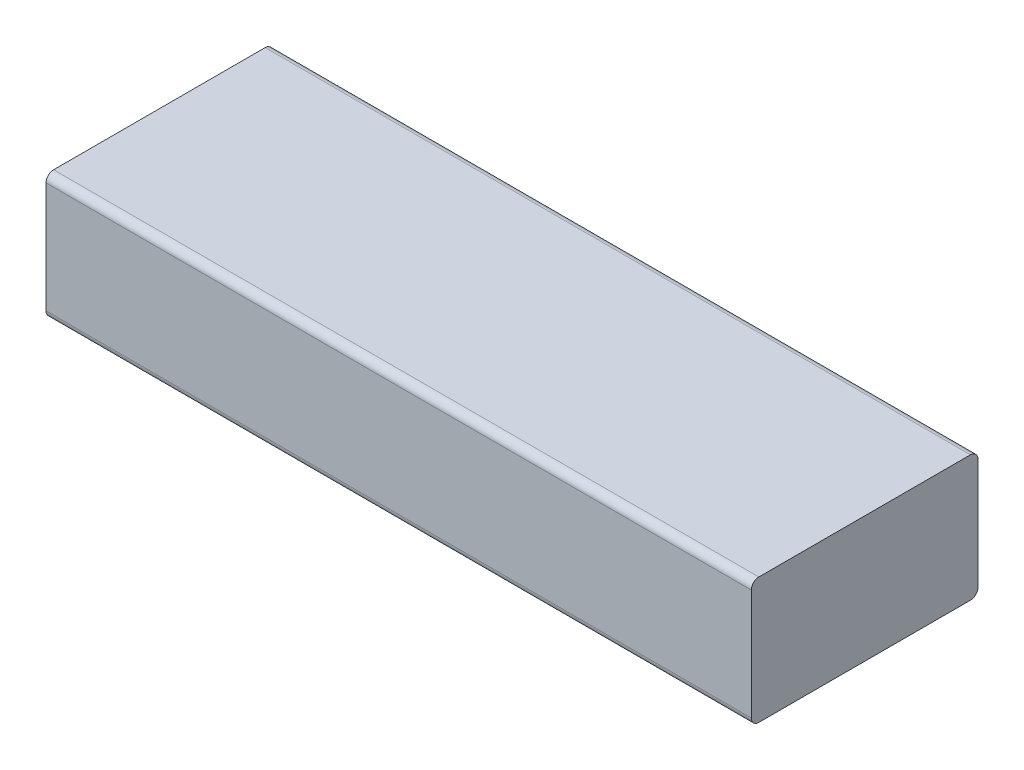
ISO-10303-21;
HEADER;
FILE_DESCRIPTION(('STEP AP214'),'2;1');
FILE_NAME('part.step','',(''),(''),'','','');
FILE_SCHEMA(('AUTOMOTIVE_DESIGN { 1 0 10303 214 1 1 1 1 }'));
ENDSEC;
DATA;
#1=APPLICATION_CONTEXT('core data for automotive mechanical design processes');
#2=APPLICATION_PROTOCOL_DEFINITION('international standard','automotive_design',2000,#1);
#3=PRODUCT_CONTEXT('',#1,'mechanical');
#4=PRODUCT('Part','Part','',(#3));
#5=PRODUCT_RELATED_PRODUCT_CATEGORY('part','',(#4));
#6=PRODUCT_DEFINITION_FORMATION('','',#4);
#7=PRODUCT_DEFINITION_CONTEXT('part definition',#1,'design');
#8=PRODUCT_DEFINITION('design','',#6,#7);
#9=PRODUCT_DEFINITION_SHAPE('','',#8);
#10=(LENGTH_UNIT() NAMED_UNIT(*) SI_UNIT(.MILLI.,.METRE.));
#11=(NAMED_UNIT(*) PLANE_ANGLE_UNIT() SI_UNIT($,.RADIAN.));
#12=(NAMED_UNIT(*) SI_UNIT($,.STERADIAN.) SOLID_ANGLE_UNIT());
#13=UNCERTAINTY_MEASURE_WITH_UNIT(LENGTH_MEASURE(1.E-05),#10,'distance_accuracy_value','');
#14=(GEOMETRIC_REPRESENTATION_CONTEXT(3) GLOBAL_UNCERTAINTY_ASSIGNED_CONTEXT((#13)) GLOBAL_UNIT_ASSIGNED_CONTEXT((#10,
#11,#12)) REPRESENTATION_CONTEXT('',''));
#15=CARTESIAN_POINT('',(0.,0.,0.));
#16=DIRECTION('',(0.,0.,1.));
#17=DIRECTION('',(1.,0.,0.));
#18=AXIS2_PLACEMENT_3D('',#15,#16,#17);
#19=CARTESIAN_POINT('',(0.,25.,0.));
#20=DIRECTION('',(0.,0.,-1.));
#21=DIRECTION('',(-1.,0.,0.));
#22=AXIS2_PLACEMENT_3D('',#19,#20,#21);
#23=PLANE('',#22);
#24=DIRECTION('',(0.,-1.,0.));
#25=VECTOR('',#24,1.);
#26=CARTESIAN_POINT('',(-70.,25.,0.));
#27=LINE('',#26,#25);
#28=CARTESIAN_POINT('',(-70.,23.5,0.));
#29=VERTEX_POINT('',#28);
#30=CARTESIAN_POINT('',(-70.,1.5,0.));
#31=VERTEX_POINT('',#30);
#32=EDGE_CURVE('E126',#29,#31,#27,.T.);
#33=ORIENTED_EDGE('',*,*,#32,.T.);
#34=DIRECTION('',(1.,0.,0.));
#35=VECTOR('',#34,1.);
#36=CARTESIAN_POINT('',(0.,1.5,0.));
#37=LINE('',#36,#35);
#38=CARTESIAN_POINT('',(70.,1.5,0.));
#39=VERTEX_POINT('',#38);
#40=EDGE_CURVE('E11',#31,#39,#37,.T.);
#41=ORIENTED_EDGE('',*,*,#40,.T.);
#42=DIRECTION('',(0.,-1.,0.));
#43=VECTOR('',#42,1.);
#44=CARTESIAN_POINT('',(70.,25.,0.));
#45=LINE('',#44,#43);
#46=CARTESIAN_POINT('',(70.,23.5,0.));
#47=VERTEX_POINT('',#46);
#48=EDGE_CURVE('E131',#47,#39,#45,.T.);
#49=ORIENTED_EDGE('',*,*,#48,.F.);
#50=DIRECTION('',(1.,0.,0.));
#51=VECTOR('',#50,1.);
#52=CARTESIAN_POINT('',(-70.,23.5,0.));
#53=LINE('',#52,#51);
#54=EDGE_CURVE('E46',#47,#29,#53,.F.);
#55=ORIENTED_EDGE('',*,*,#54,.T.);
#56=EDGE_LOOP('',(#33,#41,#49,#55));
#57=FACE_BOUND('',#56,.T.);
#58=ADVANCED_FACE('F38',(#57),#23,.F.);
#59=CARTESIAN_POINT('',(70.,25.,0.));
#60=DIRECTION('',(-1.,0.,0.));
#61=DIRECTION('',(0.,0.,1.));
#62=AXIS2_PLACEMENT_3D('',#59,#60,#61);
#63=PLANE('',#62);
#64=DIRECTION('',(0.,0.,-1.));
#65=VECTOR('',#64,1.);
#66=CARTESIAN_POINT('',(70.,0.,0.));
#67=LINE('',#66,#65);
#68=CARTESIAN_POINT('',(70.,0.,-1.5));
#69=VERTEX_POINT('',#68);
#70=CARTESIAN_POINT('',(70.,0.,-43.5));
#71=VERTEX_POINT('',#70);
#72=EDGE_CURVE('E173',#69,#71,#67,.T.);
#73=ORIENTED_EDGE('',*,*,#72,.T.);
#74=CARTESIAN_POINT('',(70.,1.5,-43.5));
#75=DIRECTION('',(-1.,0.,0.));
#76=DIRECTION('',(0.,0.,1.));
#77=AXIS2_PLACEMENT_3D('',#74,#75,#76);
#78=CIRCLE('',#77,1.5);
#79=CARTESIAN_POINT('',(70.,1.5,-45.));
#80=VERTEX_POINT('',#79);
#81=EDGE_CURVE('E148',#71,#80,#78,.F.);
#82=ORIENTED_EDGE('',*,*,#81,.T.);
#83=DIRECTION('',(0.,-1.,0.));
#84=VECTOR('',#83,1.);
#85=CARTESIAN_POINT('',(70.,25.,-45.));
#86=LINE('',#85,#84);
#87=CARTESIAN_POINT('',(70.,23.5,-45.));
#88=VERTEX_POINT('',#87);
#89=EDGE_CURVE('E125',#88,#80,#86,.T.);
#90=ORIENTED_EDGE('',*,*,#89,.F.);
#91=CARTESIAN_POINT('',(70.,23.5,-43.5));
#92=DIRECTION('',(-1.,0.,0.));
#93=DIRECTION('',(0.,0.,1.));
#94=AXIS2_PLACEMENT_3D('',#91,#92,#93);
#95=CIRCLE('',#94,1.5);
#96=CARTESIAN_POINT('',(70.,25.,-43.5));
#97=VERTEX_POINT('',#96);
#98=EDGE_CURVE('E130',#88,#97,#95,.F.);
#99=ORIENTED_EDGE('',*,*,#98,.T.);
#100=DIRECTION('',(0.,0.,-1.));
#101=VECTOR('',#100,1.);
#102=CARTESIAN_POINT('',(70.,25.,0.));
#103=LINE('',#102,#101);
#104=CARTESIAN_POINT('',(70.,25.,-1.5));
#105=VERTEX_POINT('',#104);
#106=EDGE_CURVE('E167',#105,#97,#103,.T.);
#107=ORIENTED_EDGE('',*,*,#106,.F.);
#108=CARTESIAN_POINT('',(70.,23.5,-1.5));
#109=DIRECTION('',(-1.,0.,0.));
#110=DIRECTION('',(0.,0.,1.));
#111=AXIS2_PLACEMENT_3D('',#108,#109,#110);
#112=CIRCLE('',#111,1.5);
#113=EDGE_CURVE('E60',#105,#47,#112,.F.);
#114=ORIENTED_EDGE('',*,*,#113,.T.);
#115=ORIENTED_EDGE('',*,*,#48,.T.);
#116=CARTESIAN_POINT('',(70.,1.5,-1.5));
#117=DIRECTION('',(-1.,0.,0.));
#118=DIRECTION('',(0.,0.,1.));
#119=AXIS2_PLACEMENT_3D('',#116,#117,#118);
#120=CIRCLE('',#119,1.5);
#121=EDGE_CURVE('E53',#39,#69,#120,.F.);
#122=ORIENTED_EDGE('',*,*,#121,.T.);
#123=EDGE_LOOP('',(#73,#82,#90,#99,#107,#114,#115,#122));
#124=FACE_BOUND('',#123,.T.);
#125=ADVANCED_FACE('F169',(#124),#63,.F.);
#126=CARTESIAN_POINT('',(70.,25.,-45.));
#127=DIRECTION('',(0.,0.,1.));
#128=DIRECTION('',(1.,0.,0.));
#129=AXIS2_PLACEMENT_3D('',#126,#127,#128);
#130=PLANE('',#129);
#131=ORIENTED_EDGE('',*,*,#89,.T.);
#132=DIRECTION('',(-1.,0.,0.));
#133=VECTOR('',#132,1.);
#134=CARTESIAN_POINT('',(70.,1.5,-45.));
#135=LINE('',#134,#133);
#136=CARTESIAN_POINT('',(-70.,1.5,-45.));
#137=VERTEX_POINT('',#136);
#138=EDGE_CURVE('E124',#80,#137,#135,.T.);
#139=ORIENTED_EDGE('',*,*,#138,.T.);
#140=DIRECTION('',(0.,-1.,0.));
#141=VECTOR('',#140,1.);
#142=CARTESIAN_POINT('',(-70.,25.,-45.));
#143=LINE('',#142,#141);
#144=CARTESIAN_POINT('',(-70.,23.5,-45.));
#145=VERTEX_POINT('',#144);
#146=EDGE_CURVE('E107',#145,#137,#143,.T.);
#147=ORIENTED_EDGE('',*,*,#146,.F.);
#148=DIRECTION('',(-1.,0.,0.));
#149=VECTOR('',#148,1.);
#150=CARTESIAN_POINT('',(70.,23.5,-45.));
#151=LINE('',#150,#149);
#152=EDGE_CURVE('E121',#145,#88,#151,.F.);
#153=ORIENTED_EDGE('',*,*,#152,.T.);
#154=EDGE_LOOP('',(#131,#139,#147,#153));
#155=FACE_BOUND('',#154,.T.);
#156=ADVANCED_FACE('F120',(#155),#130,.F.);
#157=CARTESIAN_POINT('',(-70.,25.,-45.));
#158=DIRECTION('',(1.,0.,0.));
#159=DIRECTION('',(0.,0.,-1.));
#160=AXIS2_PLACEMENT_3D('',#157,#158,#159);
#161=PLANE('',#160);
#162=ORIENTED_EDGE('',*,*,#146,.T.);
#163=CARTESIAN_POINT('',(-70.,1.5,-43.5));
#164=DIRECTION('',(1.,0.,0.));
#165=DIRECTION('',(0.,0.,-1.));
#166=AXIS2_PLACEMENT_3D('',#163,#164,#165);
#167=CIRCLE('',#166,1.5);
#168=CARTESIAN_POINT('',(-70.,0.,-43.5));
#169=VERTEX_POINT('',#168);
#170=EDGE_CURVE('E114',#137,#169,#167,.F.);
#171=ORIENTED_EDGE('',*,*,#170,.T.);
#172=DIRECTION('',(0.,0.,1.));
#173=VECTOR('',#172,1.);
#174=CARTESIAN_POINT('',(-70.,0.,-45.));
#175=LINE('',#174,#173);
#176=CARTESIAN_POINT('',(-70.,0.,-1.50000000000002));
#177=VERTEX_POINT('',#176);
#178=EDGE_CURVE('E170',#169,#177,#175,.T.);
#179=ORIENTED_EDGE('',*,*,#178,.T.);
#180=CARTESIAN_POINT('',(-70.,1.5,-1.5));
#181=DIRECTION('',(1.,0.,0.));
#182=DIRECTION('',(0.,0.,-1.));
#183=AXIS2_PLACEMENT_3D('',#180,#181,#182);
#184=CIRCLE('',#183,1.5);
#185=EDGE_CURVE('E115',#177,#31,#184,.F.);
#186=ORIENTED_EDGE('',*,*,#185,.T.);
#187=ORIENTED_EDGE('',*,*,#32,.F.);
#188=CARTESIAN_POINT('',(-70.,23.5,-1.5));
#189=DIRECTION('',(1.,0.,0.));
#190=DIRECTION('',(0.,0.,-1.));
#191=AXIS2_PLACEMENT_3D('',#188,#189,#190);
#192=CIRCLE('',#191,1.5);
#193=CARTESIAN_POINT('',(-70.,25.,-1.50000000000002));
#194=VERTEX_POINT('',#193);
#195=EDGE_CURVE('E133',#29,#194,#192,.F.);
#196=ORIENTED_EDGE('',*,*,#195,.T.);
#197=DIRECTION('',(0.,0.,1.));
#198=VECTOR('',#197,1.);
#199=CARTESIAN_POINT('',(-70.,25.,-45.));
#200=LINE('',#199,#198);
#201=CARTESIAN_POINT('',(-70.,25.,-43.5));
#202=VERTEX_POINT('',#201);
#203=EDGE_CURVE('E109',#202,#194,#200,.T.);
#204=ORIENTED_EDGE('',*,*,#203,.F.);
#205=CARTESIAN_POINT('',(-70.,23.5,-43.5));
#206=DIRECTION('',(1.,0.,0.));
#207=DIRECTION('',(0.,0.,-1.));
#208=AXIS2_PLACEMENT_3D('',#205,#206,#207);
#209=CIRCLE('',#208,1.5);
#210=EDGE_CURVE('E104',#202,#145,#209,.F.);
#211=ORIENTED_EDGE('',*,*,#210,.T.);
#212=EDGE_LOOP('',(#162,#171,#179,#186,#187,#196,#204,#211));
#213=FACE_BOUND('',#212,.T.);
#214=ADVANCED_FACE('F106',(#213),#161,.F.);
#215=CARTESIAN_POINT('',(0.,25.,0.));
#216=DIRECTION('',(0.,1.,0.));
#217=DIRECTION('',(0.,0.,1.));
#218=AXIS2_PLACEMENT_3D('',#215,#216,#217);
#219=PLANE('',#218);
#220=ORIENTED_EDGE('',*,*,#106,.T.);
#221=DIRECTION('',(-1.,0.,0.));
#222=VECTOR('',#221,1.);
#223=CARTESIAN_POINT('',(-70.,25.,-43.5));
#224=LINE('',#223,#222);
#225=EDGE_CURVE('E153',#97,#202,#224,.T.);
#226=ORIENTED_EDGE('',*,*,#225,.T.);
#227=ORIENTED_EDGE('',*,*,#203,.T.);
#228=DIRECTION('',(1.,0.,0.));
#229=VECTOR('',#228,1.);
#230=CARTESIAN_POINT('',(70.,25.,-1.5));
#231=LINE('',#230,#229);
#232=EDGE_CURVE('E150',#194,#105,#231,.T.);
#233=ORIENTED_EDGE('',*,*,#232,.T.);
#234=EDGE_LOOP('',(#220,#226,#227,#233));
#235=FACE_BOUND('',#234,.T.);
#236=ADVANCED_FACE('F166',(#235),#219,.T.);
#237=CARTESIAN_POINT('',(0.,0.,0.));
#238=DIRECTION('',(0.,1.,0.));
#239=DIRECTION('',(0.,0.,1.));
#240=AXIS2_PLACEMENT_3D('',#237,#238,#239);
#241=PLANE('',#240);
#242=ORIENTED_EDGE('',*,*,#178,.F.);
#243=DIRECTION('',(-1.,0.,0.));
#244=VECTOR('',#243,1.);
#245=CARTESIAN_POINT('',(0.,0.,-43.5));
#246=LINE('',#245,#244);
#247=EDGE_CURVE('E143',#169,#71,#246,.F.);
#248=ORIENTED_EDGE('',*,*,#247,.T.);
#249=ORIENTED_EDGE('',*,*,#72,.F.);
#250=DIRECTION('',(1.,0.,0.));
#251=VECTOR('',#250,1.);
#252=CARTESIAN_POINT('',(0.,0.,-1.5));
#253=LINE('',#252,#251);
#254=EDGE_CURVE('E141',#69,#177,#253,.F.);
#255=ORIENTED_EDGE('',*,*,#254,.T.);
#256=EDGE_LOOP('',(#242,#248,#249,#255));
#257=FACE_BOUND('',#256,.T.);
#258=ADVANCED_FACE('F182',(#257),#241,.F.);
#259=CARTESIAN_POINT('',(70.,1.5,-43.5));
#260=DIRECTION('',(-1.,0.,0.));
#261=DIRECTION('',(0.,0.,1.));
#262=AXIS2_PLACEMENT_3D('',#259,#260,#261);
#263=CYLINDRICAL_SURFACE('',#262,1.5);
#264=ORIENTED_EDGE('',*,*,#81,.F.);
#265=ORIENTED_EDGE('',*,*,#247,.F.);
#266=ORIENTED_EDGE('',*,*,#170,.F.);
#267=ORIENTED_EDGE('',*,*,#138,.F.);
#268=EDGE_LOOP('',(#264,#265,#266,#267));
#269=FACE_BOUND('',#268,.T.);
#270=ADVANCED_FACE('F178',(#269),#263,.T.);
#271=CARTESIAN_POINT('',(0.,23.5,-43.5));
#272=DIRECTION('',(1.,0.,0.));
#273=DIRECTION('',(0.,0.,-1.));
#274=AXIS2_PLACEMENT_3D('',#271,#272,#273);
#275=CYLINDRICAL_SURFACE('',#274,1.5);
#276=ORIENTED_EDGE('',*,*,#98,.F.);
#277=ORIENTED_EDGE('',*,*,#152,.F.);
#278=ORIENTED_EDGE('',*,*,#210,.F.);
#279=ORIENTED_EDGE('',*,*,#225,.F.);
#280=EDGE_LOOP('',(#276,#277,#278,#279));
#281=FACE_BOUND('',#280,.T.);
#282=ADVANCED_FACE('F129',(#281),#275,.T.);
#283=CARTESIAN_POINT('',(0.,1.5,-1.5));
#284=DIRECTION('',(1.,0.,0.));
#285=DIRECTION('',(0.,0.,-1.));
#286=AXIS2_PLACEMENT_3D('',#283,#284,#285);
#287=CYLINDRICAL_SURFACE('',#286,1.5);
#288=ORIENTED_EDGE('',*,*,#185,.F.);
#289=ORIENTED_EDGE('',*,*,#254,.F.);
#290=ORIENTED_EDGE('',*,*,#121,.F.);
#291=ORIENTED_EDGE('',*,*,#40,.F.);
#292=EDGE_LOOP('',(#288,#289,#290,#291));
#293=FACE_BOUND('',#292,.T.);
#294=ADVANCED_FACE('F184',(#293),#287,.T.);
#295=CARTESIAN_POINT('',(0.,23.5,-1.5));
#296=DIRECTION('',(-1.,0.,0.));
#297=DIRECTION('',(0.,0.,1.));
#298=AXIS2_PLACEMENT_3D('',#295,#296,#297);
#299=CYLINDRICAL_SURFACE('',#298,1.5);
#300=ORIENTED_EDGE('',*,*,#195,.F.);
#301=ORIENTED_EDGE('',*,*,#54,.F.);
#302=ORIENTED_EDGE('',*,*,#113,.F.);
#303=ORIENTED_EDGE('',*,*,#232,.F.);
#304=EDGE_LOOP('',(#300,#301,#302,#303));
#305=FACE_BOUND('',#304,.T.);
#306=ADVANCED_FACE('F40',(#305),#299,.T.);
#307=CLOSED_SHELL('',(#58,#125,#156,#214,#236,#258,#270,#282,#294,#306));
#308=MANIFOLD_SOLID_BREP('B2',#307);
#309=ADVANCED_BREP_SHAPE_REPRESENTATION('',(#18,#308),#14);
#310=SHAPE_DEFINITION_REPRESENTATION(#9,#309);
ENDSEC;
END-ISO-10303-21;
